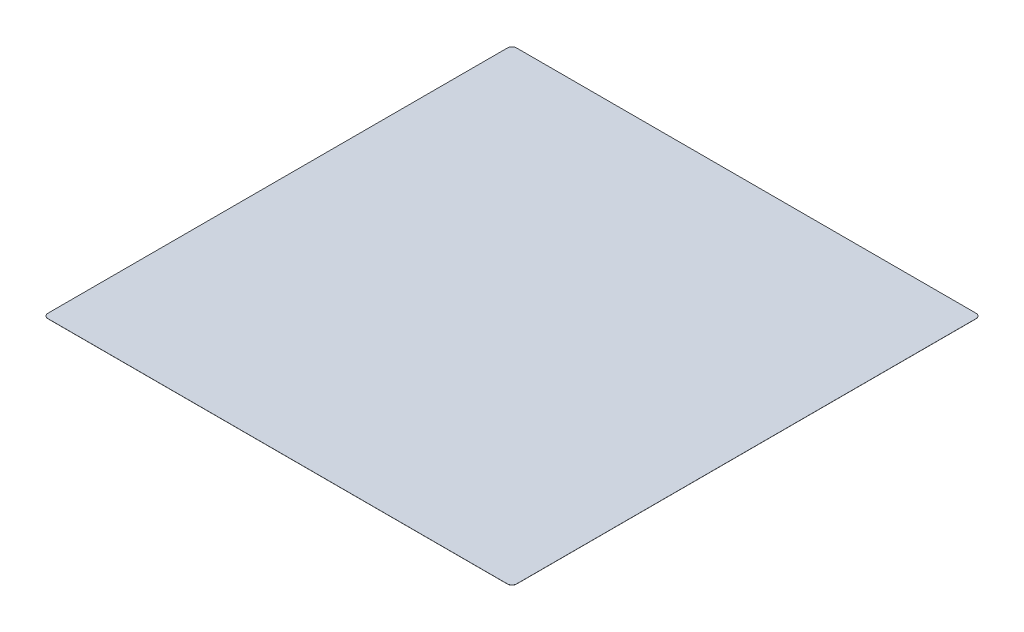
ISO-10303-21;
HEADER;
FILE_DESCRIPTION(('STEP AP214'),'2;1');
FILE_NAME('part.step','',(''),(''),'','','');
FILE_SCHEMA(('AUTOMOTIVE_DESIGN { 1 0 10303 214 1 1 1 1 }'));
ENDSEC;
DATA;
#1=APPLICATION_CONTEXT('core data for automotive mechanical design processes');
#2=APPLICATION_PROTOCOL_DEFINITION('international standard','automotive_design',2000,#1);
#3=PRODUCT_CONTEXT('',#1,'mechanical');
#4=PRODUCT('Part','Part','',(#3));
#5=PRODUCT_RELATED_PRODUCT_CATEGORY('part','',(#4));
#6=PRODUCT_DEFINITION_FORMATION('','',#4);
#7=PRODUCT_DEFINITION_CONTEXT('part definition',#1,'design');
#8=PRODUCT_DEFINITION('design','',#6,#7);
#9=PRODUCT_DEFINITION_SHAPE('','',#8);
#10=(LENGTH_UNIT() NAMED_UNIT(*) SI_UNIT(.MILLI.,.METRE.));
#11=(NAMED_UNIT(*) PLANE_ANGLE_UNIT() SI_UNIT($,.RADIAN.));
#12=(NAMED_UNIT(*) SI_UNIT($,.STERADIAN.) SOLID_ANGLE_UNIT());
#13=UNCERTAINTY_MEASURE_WITH_UNIT(LENGTH_MEASURE(1.E-05),#10,'distance_accuracy_value','');
#14=(GEOMETRIC_REPRESENTATION_CONTEXT(3) GLOBAL_UNCERTAINTY_ASSIGNED_CONTEXT((#13)) GLOBAL_UNIT_ASSIGNED_CONTEXT((#10,
#11,#12)) REPRESENTATION_CONTEXT('',''));
#15=CARTESIAN_POINT('',(0.,0.,0.));
#16=DIRECTION('',(0.,0.,1.));
#17=DIRECTION('',(1.,0.,0.));
#18=AXIS2_PLACEMENT_3D('',#15,#16,#17);
#19=CARTESIAN_POINT('',(50.,0.0127,-50.));
#20=DIRECTION('',(-1.,0.,0.));
#21=DIRECTION('',(0.,0.,1.));
#22=AXIS2_PLACEMENT_3D('',#19,#20,#21);
#23=PLANE('',#22);
#24=DIRECTION('',(0.,0.,-1.));
#25=VECTOR('',#24,1.);
#26=CARTESIAN_POINT('',(50.,0.0127,-50.));
#27=LINE('',#26,#25);
#28=CARTESIAN_POINT('',(50.,0.0127,49.));
#29=VERTEX_POINT('',#28);
#30=CARTESIAN_POINT('',(50.,0.0127,-49.));
#31=VERTEX_POINT('',#30);
#32=EDGE_CURVE('E126',#29,#31,#27,.T.);
#33=ORIENTED_EDGE('',*,*,#32,.F.);
#34=DIRECTION('',(0.,-1.,0.));
#35=VECTOR('',#34,1.);
#36=CARTESIAN_POINT('',(50.,0.0127,49.));
#37=LINE('',#36,#35);
#38=CARTESIAN_POINT('',(50.,-0.0127,49.));
#39=VERTEX_POINT('',#38);
#40=EDGE_CURVE('E110',#29,#39,#37,.T.);
#41=ORIENTED_EDGE('',*,*,#40,.T.);
#42=DIRECTION('',(0.,0.,-1.));
#43=VECTOR('',#42,1.);
#44=CARTESIAN_POINT('',(50.,-0.0127,-50.));
#45=LINE('',#44,#43);
#46=CARTESIAN_POINT('',(50.,-0.0127,-49.));
#47=VERTEX_POINT('',#46);
#48=EDGE_CURVE('E123',#39,#47,#45,.T.);
#49=ORIENTED_EDGE('',*,*,#48,.T.);
#50=DIRECTION('',(0.,-1.,0.));
#51=VECTOR('',#50,1.);
#52=CARTESIAN_POINT('',(50.,0.0127,-49.));
#53=LINE('',#52,#51);
#54=EDGE_CURVE('E129',#47,#31,#53,.F.);
#55=ORIENTED_EDGE('',*,*,#54,.T.);
#56=EDGE_LOOP('',(#33,#41,#49,#55));
#57=FACE_BOUND('',#56,.T.);
#58=ADVANCED_FACE('F39',(#57),#23,.F.);
#59=CARTESIAN_POINT('',(-50.,0.0127,-50.));
#60=DIRECTION('',(0.,0.,1.));
#61=DIRECTION('',(1.,0.,0.));
#62=AXIS2_PLACEMENT_3D('',#59,#60,#61);
#63=PLANE('',#62);
#64=DIRECTION('',(-1.,0.,0.));
#65=VECTOR('',#64,1.);
#66=CARTESIAN_POINT('',(-50.,-0.0127,-50.));
#67=LINE('',#66,#65);
#68=CARTESIAN_POINT('',(49.,-0.0127,-50.));
#69=VERTEX_POINT('',#68);
#70=CARTESIAN_POINT('',(-49.,-0.0127,-50.));
#71=VERTEX_POINT('',#70);
#72=EDGE_CURVE('E134',#69,#71,#67,.T.);
#73=ORIENTED_EDGE('',*,*,#72,.T.);
#74=DIRECTION('',(0.,-1.,0.));
#75=VECTOR('',#74,1.);
#76=CARTESIAN_POINT('',(-49.,0.0127,-50.));
#77=LINE('',#76,#75);
#78=CARTESIAN_POINT('',(-49.,0.0127,-50.));
#79=VERTEX_POINT('',#78);
#80=EDGE_CURVE('E11',#71,#79,#77,.F.);
#81=ORIENTED_EDGE('',*,*,#80,.T.);
#82=DIRECTION('',(-1.,0.,0.));
#83=VECTOR('',#82,1.);
#84=CARTESIAN_POINT('',(-50.,0.0127,-50.));
#85=LINE('',#84,#83);
#86=CARTESIAN_POINT('',(49.,0.0127,-50.));
#87=VERTEX_POINT('',#86);
#88=EDGE_CURVE('E186',#87,#79,#85,.T.);
#89=ORIENTED_EDGE('',*,*,#88,.F.);
#90=DIRECTION('',(0.,-1.,0.));
#91=VECTOR('',#90,1.);
#92=CARTESIAN_POINT('',(49.,0.0127,-50.));
#93=LINE('',#92,#91);
#94=EDGE_CURVE('E48',#87,#69,#93,.T.);
#95=ORIENTED_EDGE('',*,*,#94,.T.);
#96=EDGE_LOOP('',(#73,#81,#89,#95));
#97=FACE_BOUND('',#96,.T.);
#98=ADVANCED_FACE('F184',(#97),#63,.F.);
#99=CARTESIAN_POINT('',(-50.,0.0127,-50.));
#100=DIRECTION('',(1.,0.,0.));
#101=DIRECTION('',(0.,0.,-1.));
#102=AXIS2_PLACEMENT_3D('',#99,#100,#101);
#103=PLANE('',#102);
#104=DIRECTION('',(0.,0.,1.));
#105=VECTOR('',#104,1.);
#106=CARTESIAN_POINT('',(-50.,-0.0127,-50.));
#107=LINE('',#106,#105);
#108=CARTESIAN_POINT('',(-50.,-0.0127,-49.));
#109=VERTEX_POINT('',#108);
#110=CARTESIAN_POINT('',(-50.,-0.0127,49.));
#111=VERTEX_POINT('',#110);
#112=EDGE_CURVE('E138',#109,#111,#107,.T.);
#113=ORIENTED_EDGE('',*,*,#112,.T.);
#114=DIRECTION('',(0.,-1.,0.));
#115=VECTOR('',#114,1.);
#116=CARTESIAN_POINT('',(-50.,0.0127,49.));
#117=LINE('',#116,#115);
#118=CARTESIAN_POINT('',(-50.,0.0127,49.));
#119=VERTEX_POINT('',#118);
#120=EDGE_CURVE('E55',#111,#119,#117,.F.);
#121=ORIENTED_EDGE('',*,*,#120,.T.);
#122=DIRECTION('',(0.,0.,1.));
#123=VECTOR('',#122,1.);
#124=CARTESIAN_POINT('',(-50.,0.0127,-50.));
#125=LINE('',#124,#123);
#126=CARTESIAN_POINT('',(-50.,0.0127,-49.));
#127=VERTEX_POINT('',#126);
#128=EDGE_CURVE('E194',#127,#119,#125,.T.);
#129=ORIENTED_EDGE('',*,*,#128,.F.);
#130=DIRECTION('',(0.,-1.,0.));
#131=VECTOR('',#130,1.);
#132=CARTESIAN_POINT('',(-50.,0.0127,-49.));
#133=LINE('',#132,#131);
#134=EDGE_CURVE('E174',#127,#109,#133,.T.);
#135=ORIENTED_EDGE('',*,*,#134,.T.);
#136=EDGE_LOOP('',(#113,#121,#129,#135));
#137=FACE_BOUND('',#136,.T.);
#138=ADVANCED_FACE('F193',(#137),#103,.F.);
#139=CARTESIAN_POINT('',(-50.,0.0127,50.));
#140=DIRECTION('',(0.,0.,-1.));
#141=DIRECTION('',(-1.,0.,0.));
#142=AXIS2_PLACEMENT_3D('',#139,#140,#141);
#143=PLANE('',#142);
#144=DIRECTION('',(1.,0.,0.));
#145=VECTOR('',#144,1.);
#146=CARTESIAN_POINT('',(-50.,-0.0127,50.));
#147=LINE('',#146,#145);
#148=CARTESIAN_POINT('',(-49.,-0.0127,50.));
#149=VERTEX_POINT('',#148);
#150=CARTESIAN_POINT('',(49.,-0.0127,50.));
#151=VERTEX_POINT('',#150);
#152=EDGE_CURVE('E146',#149,#151,#147,.T.);
#153=ORIENTED_EDGE('',*,*,#152,.T.);
#154=DIRECTION('',(0.,-1.,0.));
#155=VECTOR('',#154,1.);
#156=CARTESIAN_POINT('',(49.,0.0127,50.));
#157=LINE('',#156,#155);
#158=CARTESIAN_POINT('',(49.,0.0127,50.));
#159=VERTEX_POINT('',#158);
#160=EDGE_CURVE('E111',#151,#159,#157,.F.);
#161=ORIENTED_EDGE('',*,*,#160,.T.);
#162=DIRECTION('',(1.,0.,0.));
#163=VECTOR('',#162,1.);
#164=CARTESIAN_POINT('',(-50.,0.0127,50.));
#165=LINE('',#164,#163);
#166=CARTESIAN_POINT('',(-49.,0.0127,50.));
#167=VERTEX_POINT('',#166);
#168=EDGE_CURVE('E141',#167,#159,#165,.T.);
#169=ORIENTED_EDGE('',*,*,#168,.F.);
#170=DIRECTION('',(0.,-1.,0.));
#171=VECTOR('',#170,1.);
#172=CARTESIAN_POINT('',(-49.,0.0127,50.));
#173=LINE('',#172,#171);
#174=EDGE_CURVE('E117',#167,#149,#173,.T.);
#175=ORIENTED_EDGE('',*,*,#174,.T.);
#176=EDGE_LOOP('',(#153,#161,#169,#175));
#177=FACE_BOUND('',#176,.T.);
#178=ADVANCED_FACE('F226',(#177),#143,.F.);
#179=CARTESIAN_POINT('',(0.,0.0127,0.));
#180=DIRECTION('',(0.,1.,0.));
#181=DIRECTION('',(0.,0.,1.));
#182=AXIS2_PLACEMENT_3D('',#179,#180,#181);
#183=PLANE('',#182);
#184=ORIENTED_EDGE('',*,*,#168,.T.);
#185=CARTESIAN_POINT('',(49.,0.0127,49.));
#186=DIRECTION('',(0.,1.,0.));
#187=DIRECTION('',(0.,0.,1.));
#188=AXIS2_PLACEMENT_3D('',#185,#186,#187);
#189=CIRCLE('',#188,1.);
#190=EDGE_CURVE('E171',#159,#29,#189,.T.);
#191=ORIENTED_EDGE('',*,*,#190,.T.);
#192=ORIENTED_EDGE('',*,*,#32,.T.);
#193=CARTESIAN_POINT('',(49.,0.0127,-49.));
#194=DIRECTION('',(0.,1.,0.));
#195=DIRECTION('',(0.,0.,1.));
#196=AXIS2_PLACEMENT_3D('',#193,#194,#195);
#197=CIRCLE('',#196,1.);
#198=EDGE_CURVE('E163',#31,#87,#197,.T.);
#199=ORIENTED_EDGE('',*,*,#198,.T.);
#200=ORIENTED_EDGE('',*,*,#88,.T.);
#201=CARTESIAN_POINT('',(-49.,0.0127,-49.));
#202=DIRECTION('',(0.,1.,0.));
#203=DIRECTION('',(0.,0.,1.));
#204=AXIS2_PLACEMENT_3D('',#201,#202,#203);
#205=CIRCLE('',#204,1.);
#206=EDGE_CURVE('E62',#79,#127,#205,.T.);
#207=ORIENTED_EDGE('',*,*,#206,.T.);
#208=ORIENTED_EDGE('',*,*,#128,.T.);
#209=CARTESIAN_POINT('',(-49.,0.0127,49.));
#210=DIRECTION('',(0.,1.,0.));
#211=DIRECTION('',(0.,0.,1.));
#212=AXIS2_PLACEMENT_3D('',#209,#210,#211);
#213=CIRCLE('',#212,1.);
#214=EDGE_CURVE('E168',#119,#167,#213,.T.);
#215=ORIENTED_EDGE('',*,*,#214,.T.);
#216=EDGE_LOOP('',(#184,#191,#192,#199,#200,#207,#208,#215));
#217=FACE_BOUND('',#216,.T.);
#218=ADVANCED_FACE('F203',(#217),#183,.T.);
#219=CARTESIAN_POINT('',(0.,-0.0127,0.));
#220=DIRECTION('',(0.,1.,0.));
#221=DIRECTION('',(0.,0.,1.));
#222=AXIS2_PLACEMENT_3D('',#219,#220,#221);
#223=PLANE('',#222);
#224=ORIENTED_EDGE('',*,*,#48,.F.);
#225=CARTESIAN_POINT('',(49.,-0.0127,49.));
#226=DIRECTION('',(0.,1.,0.));
#227=DIRECTION('',(0.,0.,1.));
#228=AXIS2_PLACEMENT_3D('',#225,#226,#227);
#229=CIRCLE('',#228,1.);
#230=EDGE_CURVE('E106',#39,#151,#229,.F.);
#231=ORIENTED_EDGE('',*,*,#230,.T.);
#232=ORIENTED_EDGE('',*,*,#152,.F.);
#233=CARTESIAN_POINT('',(-49.,-0.0127,49.));
#234=DIRECTION('',(0.,1.,0.));
#235=DIRECTION('',(0.,0.,1.));
#236=AXIS2_PLACEMENT_3D('',#233,#234,#235);
#237=CIRCLE('',#236,1.);
#238=EDGE_CURVE('E118',#149,#111,#237,.F.);
#239=ORIENTED_EDGE('',*,*,#238,.T.);
#240=ORIENTED_EDGE('',*,*,#112,.F.);
#241=CARTESIAN_POINT('',(-49.,-0.0127,-49.));
#242=DIRECTION('',(0.,1.,0.));
#243=DIRECTION('',(0.,0.,1.));
#244=AXIS2_PLACEMENT_3D('',#241,#242,#243);
#245=CIRCLE('',#244,1.);
#246=EDGE_CURVE('E153',#109,#71,#245,.F.);
#247=ORIENTED_EDGE('',*,*,#246,.T.);
#248=ORIENTED_EDGE('',*,*,#72,.F.);
#249=CARTESIAN_POINT('',(49.,-0.0127,-49.));
#250=DIRECTION('',(0.,1.,0.));
#251=DIRECTION('',(0.,0.,1.));
#252=AXIS2_PLACEMENT_3D('',#249,#250,#251);
#253=CIRCLE('',#252,1.);
#254=EDGE_CURVE('E128',#69,#47,#253,.F.);
#255=ORIENTED_EDGE('',*,*,#254,.T.);
#256=EDGE_LOOP('',(#224,#231,#232,#239,#240,#247,#248,#255));
#257=FACE_BOUND('',#256,.T.);
#258=ADVANCED_FACE('F131',(#257),#223,.F.);
#259=CARTESIAN_POINT('',(49.,0.0127,49.));
#260=DIRECTION('',(0.,-1.,0.));
#261=DIRECTION('',(0.,0.,-1.));
#262=AXIS2_PLACEMENT_3D('',#259,#260,#261);
#263=CYLINDRICAL_SURFACE('',#262,1.);
#264=ORIENTED_EDGE('',*,*,#190,.F.);
#265=ORIENTED_EDGE('',*,*,#160,.F.);
#266=ORIENTED_EDGE('',*,*,#230,.F.);
#267=ORIENTED_EDGE('',*,*,#40,.F.);
#268=EDGE_LOOP('',(#264,#265,#266,#267));
#269=FACE_BOUND('',#268,.T.);
#270=ADVANCED_FACE('F109',(#269),#263,.T.);
#271=CARTESIAN_POINT('',(-49.,0.0127,49.));
#272=DIRECTION('',(0.,-1.,0.));
#273=DIRECTION('',(0.,0.,-1.));
#274=AXIS2_PLACEMENT_3D('',#271,#272,#273);
#275=CYLINDRICAL_SURFACE('',#274,1.);
#276=ORIENTED_EDGE('',*,*,#214,.F.);
#277=ORIENTED_EDGE('',*,*,#120,.F.);
#278=ORIENTED_EDGE('',*,*,#238,.F.);
#279=ORIENTED_EDGE('',*,*,#174,.F.);
#280=EDGE_LOOP('',(#276,#277,#278,#279));
#281=FACE_BOUND('',#280,.T.);
#282=ADVANCED_FACE('F208',(#281),#275,.T.);
#283=CARTESIAN_POINT('',(-49.,0.0127,-49.));
#284=DIRECTION('',(0.,-1.,0.));
#285=DIRECTION('',(0.,0.,-1.));
#286=AXIS2_PLACEMENT_3D('',#283,#284,#285);
#287=CYLINDRICAL_SURFACE('',#286,1.);
#288=ORIENTED_EDGE('',*,*,#206,.F.);
#289=ORIENTED_EDGE('',*,*,#80,.F.);
#290=ORIENTED_EDGE('',*,*,#246,.F.);
#291=ORIENTED_EDGE('',*,*,#134,.F.);
#292=EDGE_LOOP('',(#288,#289,#290,#291));
#293=FACE_BOUND('',#292,.T.);
#294=ADVANCED_FACE('F192',(#293),#287,.T.);
#295=CARTESIAN_POINT('',(49.,0.0127,-49.));
#296=DIRECTION('',(0.,-1.,0.));
#297=DIRECTION('',(0.,0.,-1.));
#298=AXIS2_PLACEMENT_3D('',#295,#296,#297);
#299=CYLINDRICAL_SURFACE('',#298,1.);
#300=ORIENTED_EDGE('',*,*,#198,.F.);
#301=ORIENTED_EDGE('',*,*,#54,.F.);
#302=ORIENTED_EDGE('',*,*,#254,.F.);
#303=ORIENTED_EDGE('',*,*,#94,.F.);
#304=EDGE_LOOP('',(#300,#301,#302,#303));
#305=FACE_BOUND('',#304,.T.);
#306=ADVANCED_FACE('F41',(#305),#299,.T.);
#307=CLOSED_SHELL('',(#58,#98,#138,#178,#218,#258,#270,#282,#294,#306));
#308=MANIFOLD_SOLID_BREP('B2',#307);
#309=ADVANCED_BREP_SHAPE_REPRESENTATION('',(#18,#308),#14);
#310=SHAPE_DEFINITION_REPRESENTATION(#9,#309);
ENDSEC;
END-ISO-10303-21;
